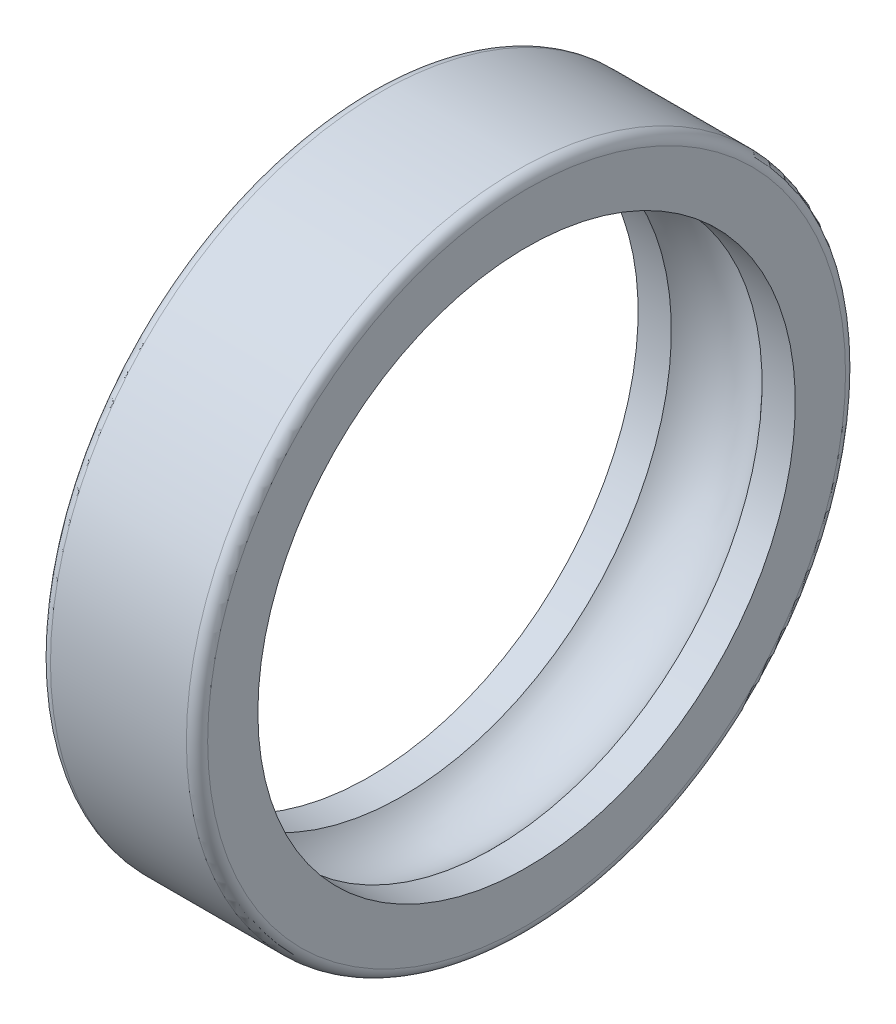
ISO-10303-21;
HEADER;
FILE_DESCRIPTION(('STEP AP214'),'2;1');
FILE_NAME('part.step','',(''),(''),'','','');
FILE_SCHEMA(('AUTOMOTIVE_DESIGN { 1 0 10303 214 1 1 1 1 }'));
ENDSEC;
DATA;
#1=APPLICATION_CONTEXT('core data for automotive mechanical design processes');
#2=APPLICATION_PROTOCOL_DEFINITION('international standard','automotive_design',2000,#1);
#3=PRODUCT_CONTEXT('',#1,'mechanical');
#4=PRODUCT('Part','Part','',(#3));
#5=PRODUCT_RELATED_PRODUCT_CATEGORY('part','',(#4));
#6=PRODUCT_DEFINITION_FORMATION('','',#4);
#7=PRODUCT_DEFINITION_CONTEXT('part definition',#1,'design');
#8=PRODUCT_DEFINITION('design','',#6,#7);
#9=PRODUCT_DEFINITION_SHAPE('','',#8);
#10=(LENGTH_UNIT() NAMED_UNIT(*) SI_UNIT(.MILLI.,.METRE.));
#11=(NAMED_UNIT(*) PLANE_ANGLE_UNIT() SI_UNIT($,.RADIAN.));
#12=(NAMED_UNIT(*) SI_UNIT($,.STERADIAN.) SOLID_ANGLE_UNIT());
#13=UNCERTAINTY_MEASURE_WITH_UNIT(LENGTH_MEASURE(1.E-05),#10,'distance_accuracy_value','');
#14=(GEOMETRIC_REPRESENTATION_CONTEXT(3) GLOBAL_UNCERTAINTY_ASSIGNED_CONTEXT((#13)) GLOBAL_UNIT_ASSIGNED_CONTEXT((#10,
#11,#12)) REPRESENTATION_CONTEXT('',''));
#15=CARTESIAN_POINT('',(0.,0.,0.));
#16=DIRECTION('',(0.,0.,1.));
#17=DIRECTION('',(1.,0.,0.));
#18=AXIS2_PLACEMENT_3D('',#15,#16,#17);
#19=CARTESIAN_POINT('',(-23.1674753554502,0.,0.));
#20=DIRECTION('',(-1.,0.,0.));
#21=DIRECTION('',(0.,0.,1.));
#22=AXIS2_PLACEMENT_3D('',#19,#20,#21);
#23=CYLINDRICAL_SURFACE('',#22,30.73311);
#24=CARTESIAN_POINT('',(-6.512015,0.,0.));
#25=DIRECTION('',(-1.,0.,0.));
#26=DIRECTION('',(0.,0.,1.));
#27=AXIS2_PLACEMENT_3D('',#24,#25,#26);
#28=CIRCLE('',#27,30.73311);
#29=CARTESIAN_POINT('',(-6.512015,0.,30.73311));
#30=VERTEX_POINT('',#29);
#31=EDGE_CURVE('E54',#30,#30,#28,.T.);
#32=ORIENTED_EDGE('',*,*,#31,.F.);
#33=EDGE_LOOP('',(#32));
#34=FACE_BOUND('',#33,.T.);
#35=CARTESIAN_POINT('',(-10.3134850475488,0.,0.));
#36=DIRECTION('',(-1.,0.,0.));
#37=DIRECTION('',(0.,0.,1.));
#38=AXIS2_PLACEMENT_3D('',#35,#36,#37);
#39=CIRCLE('',#38,30.73311);
#40=CARTESIAN_POINT('',(-10.3134850475488,0.,30.73311));
#41=VERTEX_POINT('',#40);
#42=EDGE_CURVE('E63',#41,#41,#39,.T.);
#43=ORIENTED_EDGE('',*,*,#42,.T.);
#44=EDGE_LOOP('',(#43));
#45=FACE_BOUND('',#44,.T.);
#46=ADVANCED_FACE('F34',(#34,#45),#23,.F.);
#47=CARTESIAN_POINT('',(-6.512015,37.69155,0.));
#48=DIRECTION('',(-1.,0.,0.));
#49=DIRECTION('',(0.,0.,1.));
#50=AXIS2_PLACEMENT_3D('',#47,#48,#49);
#51=PLANE('',#50);
#52=CARTESIAN_POINT('',(-6.512015,0.,0.));
#53=DIRECTION('',(-1.,0.,0.));
#54=DIRECTION('',(0.,0.,1.));
#55=AXIS2_PLACEMENT_3D('',#52,#53,#54);
#56=CIRCLE('',#55,36.473823);
#57=CARTESIAN_POINT('',(-6.512015,0.,36.473823));
#58=VERTEX_POINT('',#57);
#59=EDGE_CURVE('E41',#58,#58,#56,.F.);
#60=ORIENTED_EDGE('',*,*,#59,.T.);
#61=EDGE_LOOP('',(#60));
#62=FACE_BOUND('',#61,.T.);
#63=ORIENTED_EDGE('',*,*,#31,.T.);
#64=EDGE_LOOP('',(#63));
#65=FACE_BOUND('',#64,.T.);
#66=ADVANCED_FACE('F88',(#62,#65),#51,.F.);
#67=CARTESIAN_POINT('',(-23.1674753554502,0.,0.));
#68=DIRECTION('',(-1.,0.,0.));
#69=DIRECTION('',(0.,0.,1.));
#70=AXIS2_PLACEMENT_3D('',#67,#68,#69);
#71=CYLINDRICAL_SURFACE('',#70,37.69155);
#72=CARTESIAN_POINT('',(-7.729742,0.,0.));
#73=DIRECTION('',(-1.,0.,0.));
#74=DIRECTION('',(0.,0.,1.));
#75=AXIS2_PLACEMENT_3D('',#72,#73,#74);
#76=CIRCLE('',#75,37.69155);
#77=CARTESIAN_POINT('',(-7.729742,0.,37.69155));
#78=VERTEX_POINT('',#77);
#79=EDGE_CURVE('E45',#78,#78,#76,.T.);
#80=ORIENTED_EDGE('',*,*,#79,.T.);
#81=EDGE_LOOP('',(#80));
#82=FACE_BOUND('',#81,.T.);
#83=CARTESIAN_POINT('',(-23.270258,0.,0.));
#84=DIRECTION('',(1.,0.,0.));
#85=DIRECTION('',(0.,0.,-1.));
#86=AXIS2_PLACEMENT_3D('',#83,#84,#85);
#87=CIRCLE('',#86,37.69155);
#88=CARTESIAN_POINT('',(-23.270258,0.,-37.69155));
#89=VERTEX_POINT('',#88);
#90=EDGE_CURVE('E49',#89,#89,#87,.T.);
#91=ORIENTED_EDGE('',*,*,#90,.T.);
#92=EDGE_LOOP('',(#91));
#93=FACE_BOUND('',#92,.T.);
#94=ADVANCED_FACE('F83',(#82,#93),#71,.T.);
#95=CARTESIAN_POINT('',(-24.487985,37.69155,0.));
#96=DIRECTION('',(1.,0.,0.));
#97=DIRECTION('',(0.,0.,-1.));
#98=AXIS2_PLACEMENT_3D('',#95,#96,#97);
#99=PLANE('',#98);
#100=CARTESIAN_POINT('',(-24.487985,0.,0.));
#101=DIRECTION('',(1.,0.,0.));
#102=DIRECTION('',(0.,0.,-1.));
#103=AXIS2_PLACEMENT_3D('',#100,#101,#102);
#104=CIRCLE('',#103,36.473823);
#105=CARTESIAN_POINT('',(-24.487985,0.,-36.473823));
#106=VERTEX_POINT('',#105);
#107=EDGE_CURVE('E10',#106,#106,#104,.F.);
#108=ORIENTED_EDGE('',*,*,#107,.T.);
#109=EDGE_LOOP('',(#108));
#110=FACE_BOUND('',#109,.T.);
#111=CARTESIAN_POINT('',(-24.487985,0.,0.));
#112=DIRECTION('',(-1.,0.,0.));
#113=DIRECTION('',(0.,0.,1.));
#114=AXIS2_PLACEMENT_3D('',#111,#112,#113);
#115=CIRCLE('',#114,30.73311);
#116=CARTESIAN_POINT('',(-24.487985,0.,30.73311));
#117=VERTEX_POINT('',#116);
#118=EDGE_CURVE('E57',#117,#117,#115,.T.);
#119=ORIENTED_EDGE('',*,*,#118,.F.);
#120=EDGE_LOOP('',(#119));
#121=FACE_BOUND('',#120,.T.);
#122=ADVANCED_FACE('F78',(#110,#121),#99,.F.);
#123=CARTESIAN_POINT('',(-23.1674753554502,0.,0.));
#124=DIRECTION('',(-1.,0.,0.));
#125=DIRECTION('',(0.,0.,1.));
#126=AXIS2_PLACEMENT_3D('',#123,#124,#125);
#127=CYLINDRICAL_SURFACE('',#126,30.73311);
#128=CARTESIAN_POINT('',(-20.6865149524512,0.,0.));
#129=DIRECTION('',(-1.,0.,0.));
#130=DIRECTION('',(0.,0.,1.));
#131=AXIS2_PLACEMENT_3D('',#128,#129,#130);
#132=CIRCLE('',#131,30.73311);
#133=CARTESIAN_POINT('',(-20.6865149524512,0.,30.73311));
#134=VERTEX_POINT('',#133);
#135=EDGE_CURVE('E60',#134,#134,#132,.T.);
#136=ORIENTED_EDGE('',*,*,#135,.F.);
#137=EDGE_LOOP('',(#136));
#138=FACE_BOUND('',#137,.T.);
#139=ORIENTED_EDGE('',*,*,#118,.T.);
#140=EDGE_LOOP('',(#139));
#141=FACE_BOUND('',#140,.T.);
#142=ADVANCED_FACE('F72',(#138,#141),#127,.F.);
#143=CARTESIAN_POINT('',(-15.5,0.,0.));
#144=DIRECTION('',(-1.,0.,0.));
#145=DIRECTION('',(0.,0.,1.));
#146=AXIS2_PLACEMENT_3D('',#143,#144,#145);
#147=TOROIDAL_SURFACE('',#146,26.09415,6.95844);
#148=ORIENTED_EDGE('',*,*,#42,.F.);
#149=EDGE_LOOP('',(#148));
#150=FACE_BOUND('',#149,.T.);
#151=ORIENTED_EDGE('',*,*,#135,.T.);
#152=EDGE_LOOP('',(#151));
#153=FACE_BOUND('',#152,.T.);
#154=ADVANCED_FACE('F68',(#150,#153),#147,.F.);
#155=CARTESIAN_POINT('',(-7.729742,0.,0.));
#156=DIRECTION('',(-1.,0.,0.));
#157=DIRECTION('',(0.,0.,1.));
#158=AXIS2_PLACEMENT_3D('',#155,#156,#157);
#159=TOROIDAL_SURFACE('',#158,36.473823,1.217727);
#160=ORIENTED_EDGE('',*,*,#59,.F.);
#161=EDGE_LOOP('',(#160));
#162=FACE_BOUND('',#161,.T.);
#163=ORIENTED_EDGE('',*,*,#79,.F.);
#164=EDGE_LOOP('',(#163));
#165=FACE_BOUND('',#164,.T.);
#166=ADVANCED_FACE('F71',(#162,#165),#159,.T.);
#167=CARTESIAN_POINT('',(-23.270258,0.,0.));
#168=DIRECTION('',(1.,0.,0.));
#169=DIRECTION('',(0.,0.,-1.));
#170=AXIS2_PLACEMENT_3D('',#167,#168,#169);
#171=TOROIDAL_SURFACE('',#170,36.473823,1.217727);
#172=ORIENTED_EDGE('',*,*,#90,.F.);
#173=EDGE_LOOP('',(#172));
#174=FACE_BOUND('',#173,.T.);
#175=ORIENTED_EDGE('',*,*,#107,.F.);
#176=EDGE_LOOP('',(#175));
#177=FACE_BOUND('',#176,.T.);
#178=ADVANCED_FACE('F36',(#174,#177),#171,.T.);
#179=CLOSED_SHELL('',(#46,#66,#94,#122,#142,#154,#166,#178));
#180=MANIFOLD_SOLID_BREP('B2',#179);
#181=ADVANCED_BREP_SHAPE_REPRESENTATION('',(#18,#180),#14);
#182=SHAPE_DEFINITION_REPRESENTATION(#9,#181);
ENDSEC;
END-ISO-10303-21;
